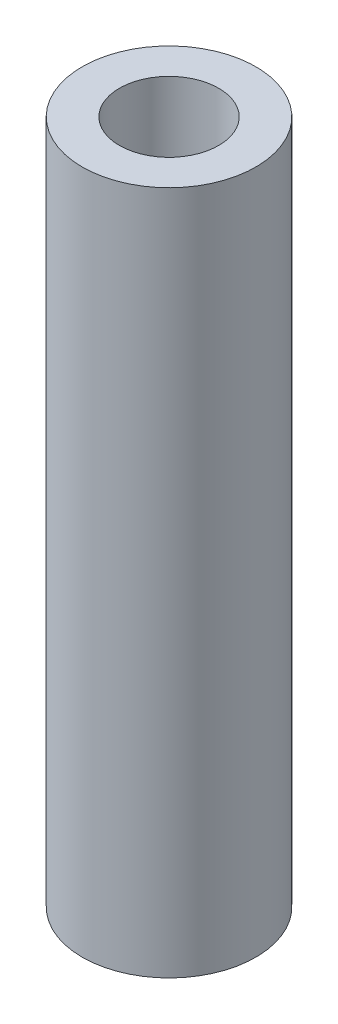
ISO-10303-21;
HEADER;
FILE_DESCRIPTION(('STEP AP214'),'2;1');
FILE_NAME('part.step','',(''),(''),'','','');
FILE_SCHEMA(('AUTOMOTIVE_DESIGN { 1 0 10303 214 1 1 1 1 }'));
ENDSEC;
DATA;
#1=APPLICATION_CONTEXT('core data for automotive mechanical design processes');
#2=APPLICATION_PROTOCOL_DEFINITION('international standard','automotive_design',2000,#1);
#3=PRODUCT_CONTEXT('',#1,'mechanical');
#4=PRODUCT('Part','Part','',(#3));
#5=PRODUCT_RELATED_PRODUCT_CATEGORY('part','',(#4));
#6=PRODUCT_DEFINITION_FORMATION('','',#4);
#7=PRODUCT_DEFINITION_CONTEXT('part definition',#1,'design');
#8=PRODUCT_DEFINITION('design','',#6,#7);
#9=PRODUCT_DEFINITION_SHAPE('','',#8);
#10=(LENGTH_UNIT() NAMED_UNIT(*) SI_UNIT(.MILLI.,.METRE.));
#11=(NAMED_UNIT(*) PLANE_ANGLE_UNIT() SI_UNIT($,.RADIAN.));
#12=(NAMED_UNIT(*) SI_UNIT($,.STERADIAN.) SOLID_ANGLE_UNIT());
#13=UNCERTAINTY_MEASURE_WITH_UNIT(LENGTH_MEASURE(1.E-05),#10,'distance_accuracy_value','');
#14=(GEOMETRIC_REPRESENTATION_CONTEXT(3) GLOBAL_UNCERTAINTY_ASSIGNED_CONTEXT((#13)) GLOBAL_UNIT_ASSIGNED_CONTEXT((#10,
#11,#12)) REPRESENTATION_CONTEXT('',''));
#15=CARTESIAN_POINT('',(0.,0.,0.));
#16=DIRECTION('',(0.,0.,1.));
#17=DIRECTION('',(1.,0.,0.));
#18=AXIS2_PLACEMENT_3D('',#15,#16,#17);
#19=CARTESIAN_POINT('',(0.,27.58,0.));
#20=DIRECTION('',(0.,1.,0.));
#21=DIRECTION('',(0.,0.,1.));
#22=AXIS2_PLACEMENT_3D('',#19,#20,#21);
#23=PLANE('',#22);
#24=CARTESIAN_POINT('',(0.,27.58,0.));
#25=DIRECTION('',(0.,1.,0.));
#26=DIRECTION('',(0.,0.,1.));
#27=AXIS2_PLACEMENT_3D('',#24,#25,#26);
#28=CIRCLE('',#27,3.5);
#29=CARTESIAN_POINT('',(0.,27.58,3.5));
#30=VERTEX_POINT('',#29);
#31=EDGE_CURVE('E10',#30,#30,#28,.T.);
#32=ORIENTED_EDGE('',*,*,#31,.T.);
#33=EDGE_LOOP('',(#32));
#34=FACE_BOUND('',#33,.T.);
#35=CARTESIAN_POINT('',(0.,27.58,0.));
#36=DIRECTION('',(0.,1.,0.));
#37=DIRECTION('',(0.,0.,1.));
#38=AXIS2_PLACEMENT_3D('',#35,#36,#37);
#39=CIRCLE('',#38,2.);
#40=CARTESIAN_POINT('',(0.,27.58,2.));
#41=VERTEX_POINT('',#40);
#42=EDGE_CURVE('E58',#41,#41,#39,.T.);
#43=ORIENTED_EDGE('',*,*,#42,.F.);
#44=EDGE_LOOP('',(#43));
#45=FACE_BOUND('',#44,.T.);
#46=ADVANCED_FACE('F45',(#34,#45),#23,.T.);
#47=CARTESIAN_POINT('',(0.,0.,0.));
#48=DIRECTION('',(0.,1.,0.));
#49=DIRECTION('',(0.,0.,1.));
#50=AXIS2_PLACEMENT_3D('',#47,#48,#49);
#51=PLANE('',#50);
#52=CARTESIAN_POINT('',(0.,0.,0.));
#53=DIRECTION('',(0.,1.,0.));
#54=DIRECTION('',(0.,0.,1.));
#55=AXIS2_PLACEMENT_3D('',#52,#53,#54);
#56=CIRCLE('',#55,3.5);
#57=CARTESIAN_POINT('',(0.,0.,3.5));
#58=VERTEX_POINT('',#57);
#59=EDGE_CURVE('E49',#58,#58,#56,.T.);
#60=ORIENTED_EDGE('',*,*,#59,.F.);
#61=EDGE_LOOP('',(#60));
#62=FACE_BOUND('',#61,.T.);
#63=CARTESIAN_POINT('',(0.,0.,0.));
#64=DIRECTION('',(0.,1.,0.));
#65=DIRECTION('',(0.,0.,1.));
#66=AXIS2_PLACEMENT_3D('',#63,#64,#65);
#67=CIRCLE('',#66,2.);
#68=CARTESIAN_POINT('',(0.,0.,2.));
#69=VERTEX_POINT('',#68);
#70=EDGE_CURVE('E60',#69,#69,#67,.T.);
#71=ORIENTED_EDGE('',*,*,#70,.T.);
#72=EDGE_LOOP('',(#71));
#73=FACE_BOUND('',#72,.T.);
#74=ADVANCED_FACE('F72',(#62,#73),#51,.F.);
#75=CARTESIAN_POINT('',(0.,27.58,0.));
#76=DIRECTION('',(0.,-1.,0.));
#77=DIRECTION('',(0.,0.,-1.));
#78=AXIS2_PLACEMENT_3D('',#75,#76,#77);
#79=CYLINDRICAL_SURFACE('',#78,3.5);
#80=ORIENTED_EDGE('',*,*,#31,.F.);
#81=EDGE_LOOP('',(#80));
#82=FACE_BOUND('',#81,.T.);
#83=ORIENTED_EDGE('',*,*,#59,.T.);
#84=EDGE_LOOP('',(#83));
#85=FACE_BOUND('',#84,.T.);
#86=ADVANCED_FACE('F47',(#82,#85),#79,.T.);
#87=CARTESIAN_POINT('',(0.,27.58,0.));
#88=DIRECTION('',(0.,-1.,0.));
#89=DIRECTION('',(0.,0.,-1.));
#90=AXIS2_PLACEMENT_3D('',#87,#88,#89);
#91=CYLINDRICAL_SURFACE('',#90,2.);
#92=ORIENTED_EDGE('',*,*,#42,.T.);
#93=EDGE_LOOP('',(#92));
#94=FACE_BOUND('',#93,.T.);
#95=ORIENTED_EDGE('',*,*,#70,.F.);
#96=EDGE_LOOP('',(#95));
#97=FACE_BOUND('',#96,.T.);
#98=ADVANCED_FACE('F68',(#94,#97),#91,.F.);
#99=CLOSED_SHELL('',(#46,#74,#86,#98));
#100=MANIFOLD_SOLID_BREP('B2',#99);
#101=ADVANCED_BREP_SHAPE_REPRESENTATION('',(#18,#100),#14);
#102=SHAPE_DEFINITION_REPRESENTATION(#9,#101);
ENDSEC;
END-ISO-10303-21;
